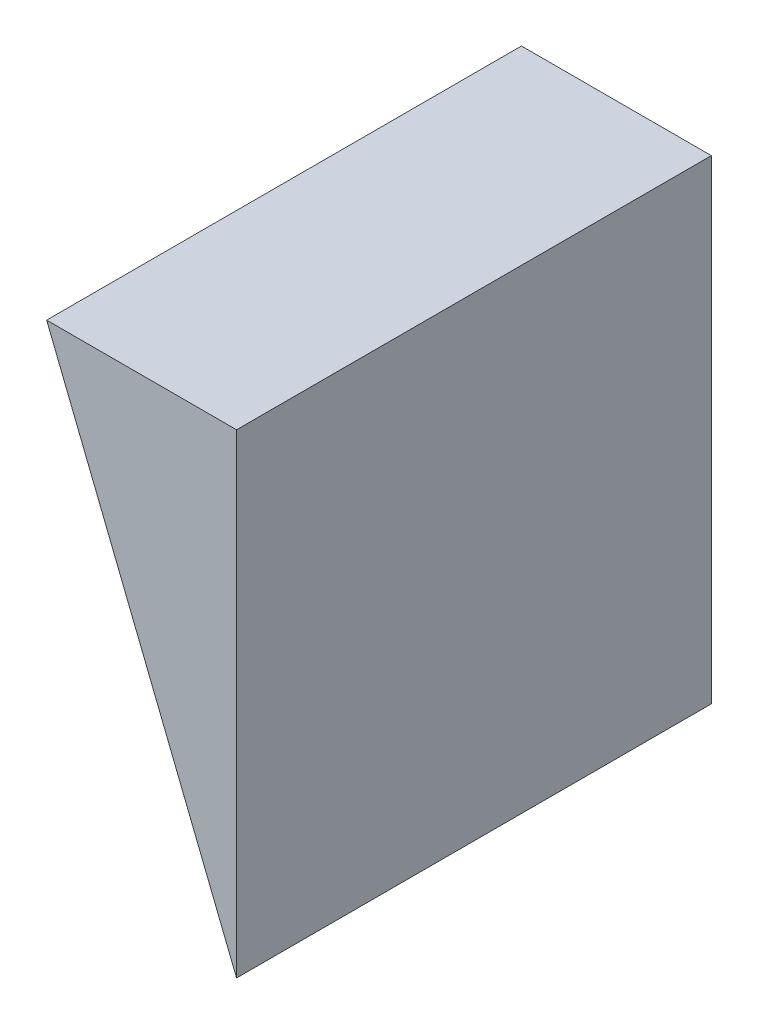
ISO-10303-21;
HEADER;
FILE_DESCRIPTION(('STEP AP214'),'2;1');
FILE_NAME('part.step','',(''),(''),'','','');
FILE_SCHEMA(('AUTOMOTIVE_DESIGN { 1 0 10303 214 1 1 1 1 }'));
ENDSEC;
DATA;
#1=APPLICATION_CONTEXT('core data for automotive mechanical design processes');
#2=APPLICATION_PROTOCOL_DEFINITION('international standard','automotive_design',2000,#1);
#3=PRODUCT_CONTEXT('',#1,'mechanical');
#4=PRODUCT('Part','Part','',(#3));
#5=PRODUCT_RELATED_PRODUCT_CATEGORY('part','',(#4));
#6=PRODUCT_DEFINITION_FORMATION('','',#4);
#7=PRODUCT_DEFINITION_CONTEXT('part definition',#1,'design');
#8=PRODUCT_DEFINITION('design','',#6,#7);
#9=PRODUCT_DEFINITION_SHAPE('','',#8);
#10=(LENGTH_UNIT() NAMED_UNIT(*) SI_UNIT(.MILLI.,.METRE.));
#11=(NAMED_UNIT(*) PLANE_ANGLE_UNIT() SI_UNIT($,.RADIAN.));
#12=(NAMED_UNIT(*) SI_UNIT($,.STERADIAN.) SOLID_ANGLE_UNIT());
#13=UNCERTAINTY_MEASURE_WITH_UNIT(LENGTH_MEASURE(1.E-05),#10,'distance_accuracy_value','');
#14=(GEOMETRIC_REPRESENTATION_CONTEXT(3) GLOBAL_UNCERTAINTY_ASSIGNED_CONTEXT((#13)) GLOBAL_UNIT_ASSIGNED_CONTEXT((#10,
#11,#12)) REPRESENTATION_CONTEXT('',''));
#15=CARTESIAN_POINT('',(0.,0.,0.));
#16=DIRECTION('',(0.,0.,1.));
#17=DIRECTION('',(1.,0.,0.));
#18=AXIS2_PLACEMENT_3D('',#15,#16,#17);
#19=CARTESIAN_POINT('',(-2.,0.,5.));
#20=DIRECTION('',(0.,-1.,0.));
#21=DIRECTION('',(0.,0.,-1.));
#22=AXIS2_PLACEMENT_3D('',#19,#20,#21);
#23=PLANE('',#22);
#24=DIRECTION('',(-1.,0.,0.));
#25=VECTOR('',#24,1.);
#26=CARTESIAN_POINT('',(-2.,0.,0.));
#27=LINE('',#26,#25);
#28=CARTESIAN_POINT('',(0.,0.,0.));
#29=VERTEX_POINT('',#28);
#30=CARTESIAN_POINT('',(-2.,0.,0.));
#31=VERTEX_POINT('',#30);
#32=EDGE_CURVE('E88',#29,#31,#27,.T.);
#33=ORIENTED_EDGE('',*,*,#32,.T.);
#34=DIRECTION('',(0.,0.,-1.));
#35=VECTOR('',#34,1.);
#36=CARTESIAN_POINT('',(-2.,0.,5.));
#37=LINE('',#36,#35);
#38=CARTESIAN_POINT('',(-2.,0.,5.));
#39=VERTEX_POINT('',#38);
#40=EDGE_CURVE('E11',#39,#31,#37,.T.);
#41=ORIENTED_EDGE('',*,*,#40,.F.);
#42=DIRECTION('',(-1.,0.,0.));
#43=VECTOR('',#42,1.);
#44=CARTESIAN_POINT('',(-2.,0.,5.));
#45=LINE('',#44,#43);
#46=CARTESIAN_POINT('',(0.,0.,5.));
#47=VERTEX_POINT('',#46);
#48=EDGE_CURVE('E81',#47,#39,#45,.T.);
#49=ORIENTED_EDGE('',*,*,#48,.F.);
#50=DIRECTION('',(0.,0.,-1.));
#51=VECTOR('',#50,1.);
#52=CARTESIAN_POINT('',(0.,0.,5.));
#53=LINE('',#52,#51);
#54=EDGE_CURVE('E89',#47,#29,#53,.T.);
#55=ORIENTED_EDGE('',*,*,#54,.T.);
#56=EDGE_LOOP('',(#33,#41,#49,#55));
#57=FACE_BOUND('',#56,.T.);
#58=ADVANCED_FACE('F41',(#57),#23,.F.);
#59=CARTESIAN_POINT('',(0.,-5.,5.));
#60=DIRECTION('',(0.928476690885259,0.371390676354104,0.));
#61=DIRECTION('',(-0.371390676354104,0.928476690885259,0.));
#62=AXIS2_PLACEMENT_3D('',#59,#60,#61);
#63=PLANE('',#62);
#64=DIRECTION('',(0.371390676354104,-0.928476690885259,0.));
#65=VECTOR('',#64,1.);
#66=CARTESIAN_POINT('',(0.,-5.,0.));
#67=LINE('',#66,#65);
#68=CARTESIAN_POINT('',(0.,-5.,0.));
#69=VERTEX_POINT('',#68);
#70=EDGE_CURVE('E69',#31,#69,#67,.T.);
#71=ORIENTED_EDGE('',*,*,#70,.T.);
#72=DIRECTION('',(0.,0.,-1.));
#73=VECTOR('',#72,1.);
#74=CARTESIAN_POINT('',(0.,-5.,5.));
#75=LINE('',#74,#73);
#76=CARTESIAN_POINT('',(0.,-5.,5.));
#77=VERTEX_POINT('',#76);
#78=EDGE_CURVE('E49',#77,#69,#75,.T.);
#79=ORIENTED_EDGE('',*,*,#78,.F.);
#80=DIRECTION('',(0.371390676354104,-0.928476690885259,0.));
#81=VECTOR('',#80,1.);
#82=CARTESIAN_POINT('',(0.,-5.,5.));
#83=LINE('',#82,#81);
#84=EDGE_CURVE('E77',#39,#77,#83,.T.);
#85=ORIENTED_EDGE('',*,*,#84,.F.);
#86=ORIENTED_EDGE('',*,*,#40,.T.);
#87=EDGE_LOOP('',(#71,#79,#85,#86));
#88=FACE_BOUND('',#87,.T.);
#89=ADVANCED_FACE('F78',(#88),#63,.F.);
#90=CARTESIAN_POINT('',(0.,0.,5.));
#91=DIRECTION('',(-1.,0.,0.));
#92=DIRECTION('',(0.,-1.,0.));
#93=AXIS2_PLACEMENT_3D('',#90,#91,#92);
#94=PLANE('',#93);
#95=DIRECTION('',(0.,1.,0.));
#96=VECTOR('',#95,1.);
#97=CARTESIAN_POINT('',(0.,0.,0.));
#98=LINE('',#97,#96);
#99=EDGE_CURVE('E74',#69,#29,#98,.T.);
#100=ORIENTED_EDGE('',*,*,#99,.T.);
#101=ORIENTED_EDGE('',*,*,#54,.F.);
#102=DIRECTION('',(0.,1.,0.));
#103=VECTOR('',#102,1.);
#104=CARTESIAN_POINT('',(0.,0.,5.));
#105=LINE('',#104,#103);
#106=EDGE_CURVE('E57',#77,#47,#105,.T.);
#107=ORIENTED_EDGE('',*,*,#106,.F.);
#108=ORIENTED_EDGE('',*,*,#78,.T.);
#109=EDGE_LOOP('',(#100,#101,#107,#108));
#110=FACE_BOUND('',#109,.T.);
#111=ADVANCED_FACE('F96',(#110),#94,.F.);
#112=CARTESIAN_POINT('',(0.,0.,5.));
#113=DIRECTION('',(0.,0.,-1.));
#114=DIRECTION('',(-1.,0.,0.));
#115=AXIS2_PLACEMENT_3D('',#112,#113,#114);
#116=PLANE('',#115);
#117=ORIENTED_EDGE('',*,*,#48,.T.);
#118=ORIENTED_EDGE('',*,*,#84,.T.);
#119=ORIENTED_EDGE('',*,*,#106,.T.);
#120=EDGE_LOOP('',(#117,#118,#119));
#121=FACE_BOUND('',#120,.T.);
#122=ADVANCED_FACE('F84',(#121),#116,.F.);
#123=CARTESIAN_POINT('',(0.,0.,0.));
#124=DIRECTION('',(0.,0.,-1.));
#125=DIRECTION('',(-1.,0.,0.));
#126=AXIS2_PLACEMENT_3D('',#123,#124,#125);
#127=PLANE('',#126);
#128=ORIENTED_EDGE('',*,*,#32,.F.);
#129=ORIENTED_EDGE('',*,*,#99,.F.);
#130=ORIENTED_EDGE('',*,*,#70,.F.);
#131=EDGE_LOOP('',(#128,#129,#130));
#132=FACE_BOUND('',#131,.T.);
#133=ADVANCED_FACE('F97',(#132),#127,.T.);
#134=CLOSED_SHELL('',(#58,#89,#111,#122,#133));
#135=MANIFOLD_SOLID_BREP('B2',#134);
#136=ADVANCED_BREP_SHAPE_REPRESENTATION('',(#18,#135),#14);
#137=SHAPE_DEFINITION_REPRESENTATION(#9,#136);
ENDSEC;
END-ISO-10303-21;
